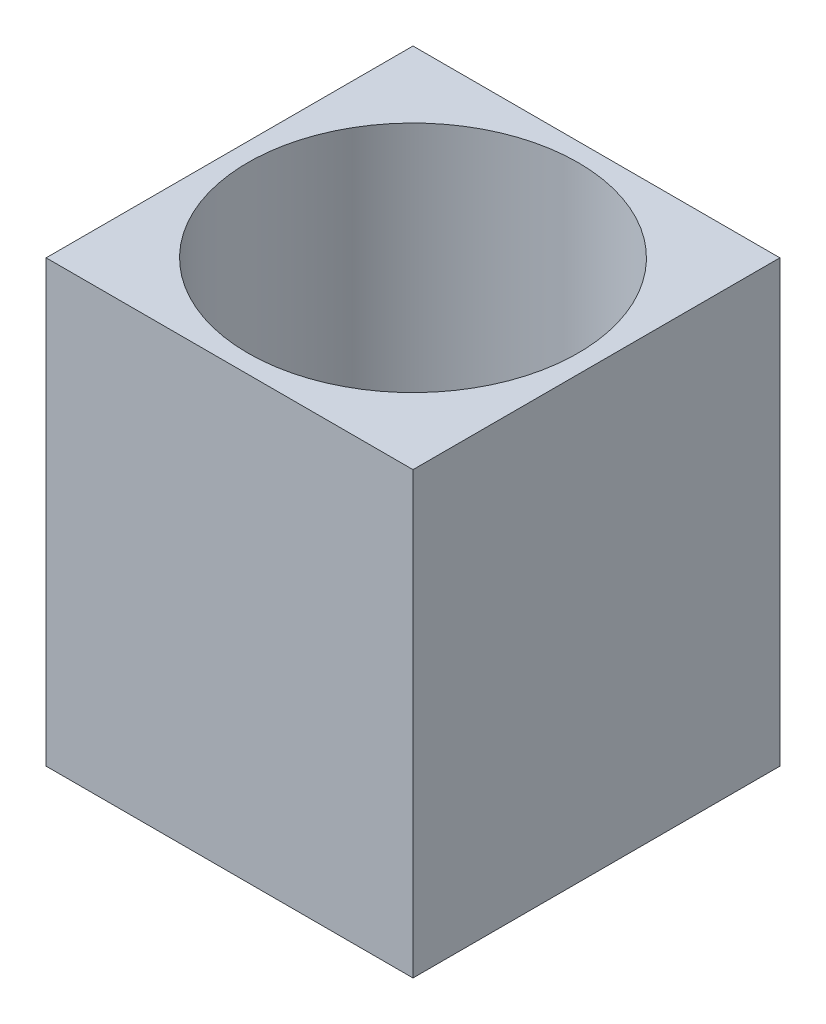
ISO-10303-21;
HEADER;
FILE_DESCRIPTION(('STEP AP214'),'2;1');
FILE_NAME('part.step','',(''),(''),'','','');
FILE_SCHEMA(('AUTOMOTIVE_DESIGN { 1 0 10303 214 1 1 1 1 }'));
ENDSEC;
DATA;
#1=APPLICATION_CONTEXT('core data for automotive mechanical design processes');
#2=APPLICATION_PROTOCOL_DEFINITION('international standard','automotive_design',2000,#1);
#3=PRODUCT_CONTEXT('',#1,'mechanical');
#4=PRODUCT('Part','Part','',(#3));
#5=PRODUCT_RELATED_PRODUCT_CATEGORY('part','',(#4));
#6=PRODUCT_DEFINITION_FORMATION('','',#4);
#7=PRODUCT_DEFINITION_CONTEXT('part definition',#1,'design');
#8=PRODUCT_DEFINITION('design','',#6,#7);
#9=PRODUCT_DEFINITION_SHAPE('','',#8);
#10=(LENGTH_UNIT() NAMED_UNIT(*) SI_UNIT(.MILLI.,.METRE.));
#11=(NAMED_UNIT(*) PLANE_ANGLE_UNIT() SI_UNIT($,.RADIAN.));
#12=(NAMED_UNIT(*) SI_UNIT($,.STERADIAN.) SOLID_ANGLE_UNIT());
#13=UNCERTAINTY_MEASURE_WITH_UNIT(LENGTH_MEASURE(1.E-05),#10,'distance_accuracy_value','');
#14=(GEOMETRIC_REPRESENTATION_CONTEXT(3) GLOBAL_UNCERTAINTY_ASSIGNED_CONTEXT((#13)) GLOBAL_UNIT_ASSIGNED_CONTEXT((#10,
#11,#12)) REPRESENTATION_CONTEXT('',''));
#15=CARTESIAN_POINT('',(0.,0.,0.));
#16=DIRECTION('',(0.,0.,1.));
#17=DIRECTION('',(1.,0.,0.));
#18=AXIS2_PLACEMENT_3D('',#15,#16,#17);
#19=CARTESIAN_POINT('',(317.5,-254.,317.5));
#20=DIRECTION('',(1.,0.,0.));
#21=DIRECTION('',(0.,0.,-1.));
#22=AXIS2_PLACEMENT_3D('',#19,#20,#21);
#23=PLANE('',#22);
#24=DIRECTION('',(0.,1.,0.));
#25=VECTOR('',#24,1.);
#26=CARTESIAN_POINT('',(317.5,-254.,-317.5));
#27=LINE('',#26,#25);
#28=CARTESIAN_POINT('',(317.5,-254.,-317.5));
#29=VERTEX_POINT('',#28);
#30=CARTESIAN_POINT('',(317.5,508.,-317.5));
#31=VERTEX_POINT('',#30);
#32=EDGE_CURVE('E36',#29,#31,#27,.T.);
#33=ORIENTED_EDGE('',*,*,#32,.T.);
#34=DIRECTION('',(0.,0.,-1.));
#35=VECTOR('',#34,1.);
#36=CARTESIAN_POINT('',(317.5,508.,317.5));
#37=LINE('',#36,#35);
#38=CARTESIAN_POINT('',(317.5,508.,317.5));
#39=VERTEX_POINT('',#38);
#40=EDGE_CURVE('E73',#39,#31,#37,.T.);
#41=ORIENTED_EDGE('',*,*,#40,.F.);
#42=DIRECTION('',(0.,1.,0.));
#43=VECTOR('',#42,1.);
#44=CARTESIAN_POINT('',(317.5,-254.,317.5));
#45=LINE('',#44,#43);
#46=CARTESIAN_POINT('',(317.5,-254.,317.5));
#47=VERTEX_POINT('',#46);
#48=EDGE_CURVE('E11',#47,#39,#45,.T.);
#49=ORIENTED_EDGE('',*,*,#48,.F.);
#50=DIRECTION('',(0.,0.,-1.));
#51=VECTOR('',#50,1.);
#52=CARTESIAN_POINT('',(317.5,-254.,317.5));
#53=LINE('',#52,#51);
#54=EDGE_CURVE('E74',#47,#29,#53,.T.);
#55=ORIENTED_EDGE('',*,*,#54,.T.);
#56=EDGE_LOOP('',(#33,#41,#49,#55));
#57=FACE_BOUND('',#56,.T.);
#58=ADVANCED_FACE('F33',(#57),#23,.T.);
#59=CARTESIAN_POINT('',(-317.5,-254.,317.5));
#60=DIRECTION('',(0.,0.,1.));
#61=DIRECTION('',(1.,0.,0.));
#62=AXIS2_PLACEMENT_3D('',#59,#60,#61);
#63=PLANE('',#62);
#64=ORIENTED_EDGE('',*,*,#48,.T.);
#65=DIRECTION('',(1.,0.,0.));
#66=VECTOR('',#65,1.);
#67=CARTESIAN_POINT('',(-317.5,508.,317.5));
#68=LINE('',#67,#66);
#69=CARTESIAN_POINT('',(-317.5,508.,317.5));
#70=VERTEX_POINT('',#69);
#71=EDGE_CURVE('E91',#70,#39,#68,.T.);
#72=ORIENTED_EDGE('',*,*,#71,.F.);
#73=DIRECTION('',(0.,1.,0.));
#74=VECTOR('',#73,1.);
#75=CARTESIAN_POINT('',(-317.5,-254.,317.5));
#76=LINE('',#75,#74);
#77=CARTESIAN_POINT('',(-317.5,-254.,317.5));
#78=VERTEX_POINT('',#77);
#79=EDGE_CURVE('E41',#78,#70,#76,.T.);
#80=ORIENTED_EDGE('',*,*,#79,.F.);
#81=DIRECTION('',(1.,0.,0.));
#82=VECTOR('',#81,1.);
#83=CARTESIAN_POINT('',(-317.5,-254.,317.5));
#84=LINE('',#83,#82);
#85=EDGE_CURVE('E79',#78,#47,#84,.T.);
#86=ORIENTED_EDGE('',*,*,#85,.T.);
#87=EDGE_LOOP('',(#64,#72,#80,#86));
#88=FACE_BOUND('',#87,.T.);
#89=ADVANCED_FACE('F112',(#88),#63,.T.);
#90=CARTESIAN_POINT('',(-317.5,-254.,317.5));
#91=DIRECTION('',(-1.,0.,0.));
#92=DIRECTION('',(0.,0.,1.));
#93=AXIS2_PLACEMENT_3D('',#90,#91,#92);
#94=PLANE('',#93);
#95=ORIENTED_EDGE('',*,*,#79,.T.);
#96=DIRECTION('',(0.,0.,1.));
#97=VECTOR('',#96,1.);
#98=CARTESIAN_POINT('',(-317.5,508.,317.5));
#99=LINE('',#98,#97);
#100=CARTESIAN_POINT('',(-317.5,508.,-317.5));
#101=VERTEX_POINT('',#100);
#102=EDGE_CURVE('E86',#101,#70,#99,.T.);
#103=ORIENTED_EDGE('',*,*,#102,.F.);
#104=DIRECTION('',(0.,1.,0.));
#105=VECTOR('',#104,1.);
#106=CARTESIAN_POINT('',(-317.5,-254.,-317.5));
#107=LINE('',#106,#105);
#108=CARTESIAN_POINT('',(-317.5,-254.,-317.5));
#109=VERTEX_POINT('',#108);
#110=EDGE_CURVE('E78',#109,#101,#107,.T.);
#111=ORIENTED_EDGE('',*,*,#110,.F.);
#112=DIRECTION('',(0.,0.,1.));
#113=VECTOR('',#112,1.);
#114=CARTESIAN_POINT('',(-317.5,-254.,317.5));
#115=LINE('',#114,#113);
#116=EDGE_CURVE('E105',#109,#78,#115,.T.);
#117=ORIENTED_EDGE('',*,*,#116,.T.);
#118=EDGE_LOOP('',(#95,#103,#111,#117));
#119=FACE_BOUND('',#118,.T.);
#120=ADVANCED_FACE('F109',(#119),#94,.T.);
#121=CARTESIAN_POINT('',(-317.5,-254.,-317.5));
#122=DIRECTION('',(0.,0.,-1.));
#123=DIRECTION('',(-1.,0.,0.));
#124=AXIS2_PLACEMENT_3D('',#121,#122,#123);
#125=PLANE('',#124);
#126=ORIENTED_EDGE('',*,*,#110,.T.);
#127=DIRECTION('',(-1.,0.,0.));
#128=VECTOR('',#127,1.);
#129=CARTESIAN_POINT('',(-317.5,508.,-317.5));
#130=LINE('',#129,#128);
#131=EDGE_CURVE('E81',#31,#101,#130,.T.);
#132=ORIENTED_EDGE('',*,*,#131,.F.);
#133=ORIENTED_EDGE('',*,*,#32,.F.);
#134=DIRECTION('',(-1.,0.,0.));
#135=VECTOR('',#134,1.);
#136=CARTESIAN_POINT('',(-317.5,-254.,-317.5));
#137=LINE('',#136,#135);
#138=EDGE_CURVE('E103',#29,#109,#137,.T.);
#139=ORIENTED_EDGE('',*,*,#138,.T.);
#140=EDGE_LOOP('',(#126,#132,#133,#139));
#141=FACE_BOUND('',#140,.T.);
#142=ADVANCED_FACE('F82',(#141),#125,.T.);
#143=CARTESIAN_POINT('',(0.,-254.,0.));
#144=DIRECTION('',(0.,-1.,0.));
#145=DIRECTION('',(0.,0.,-1.));
#146=AXIS2_PLACEMENT_3D('',#143,#144,#145);
#147=PLANE('',#146);
#148=CARTESIAN_POINT('',(0.,-254.,0.));
#149=DIRECTION('',(0.,1.,0.));
#150=DIRECTION('',(0.,0.,1.));
#151=AXIS2_PLACEMENT_3D('',#148,#149,#150);
#152=CIRCLE('',#151,285.75);
#153=CARTESIAN_POINT('',(0.,-254.,285.75));
#154=VERTEX_POINT('',#153);
#155=EDGE_CURVE('E99',#154,#154,#152,.T.);
#156=ORIENTED_EDGE('',*,*,#155,.T.);
#157=EDGE_LOOP('',(#156));
#158=FACE_BOUND('',#157,.T.);
#159=ORIENTED_EDGE('',*,*,#54,.F.);
#160=ORIENTED_EDGE('',*,*,#85,.F.);
#161=ORIENTED_EDGE('',*,*,#116,.F.);
#162=ORIENTED_EDGE('',*,*,#138,.F.);
#163=EDGE_LOOP('',(#159,#160,#161,#162));
#164=FACE_BOUND('',#163,.T.);
#165=ADVANCED_FACE('F114',(#158,#164),#147,.T.);
#166=CARTESIAN_POINT('',(0.,-254.,0.));
#167=DIRECTION('',(0.,1.,0.));
#168=DIRECTION('',(0.,0.,1.));
#169=AXIS2_PLACEMENT_3D('',#166,#167,#168);
#170=CYLINDRICAL_SURFACE('',#169,285.75);
#171=ORIENTED_EDGE('',*,*,#155,.F.);
#172=EDGE_LOOP('',(#171));
#173=FACE_BOUND('',#172,.T.);
#174=CARTESIAN_POINT('',(0.,508.,0.));
#175=DIRECTION('',(0.,1.,0.));
#176=DIRECTION('',(0.,0.,1.));
#177=AXIS2_PLACEMENT_3D('',#174,#175,#176);
#178=CIRCLE('',#177,285.75);
#179=CARTESIAN_POINT('',(0.,508.,285.75));
#180=VERTEX_POINT('',#179);
#181=EDGE_CURVE('E92',#180,#180,#178,.T.);
#182=ORIENTED_EDGE('',*,*,#181,.T.);
#183=EDGE_LOOP('',(#182));
#184=FACE_BOUND('',#183,.T.);
#185=ADVANCED_FACE('F116',(#173,#184),#170,.F.);
#186=CARTESIAN_POINT('',(0.,508.,0.));
#187=DIRECTION('',(0.,-1.,0.));
#188=DIRECTION('',(0.,0.,-1.));
#189=AXIS2_PLACEMENT_3D('',#186,#187,#188);
#190=PLANE('',#189);
#191=ORIENTED_EDGE('',*,*,#40,.T.);
#192=ORIENTED_EDGE('',*,*,#131,.T.);
#193=ORIENTED_EDGE('',*,*,#102,.T.);
#194=ORIENTED_EDGE('',*,*,#71,.T.);
#195=EDGE_LOOP('',(#191,#192,#193,#194));
#196=FACE_BOUND('',#195,.T.);
#197=ORIENTED_EDGE('',*,*,#181,.F.);
#198=EDGE_LOOP('',(#197));
#199=FACE_BOUND('',#198,.T.);
#200=ADVANCED_FACE('F89',(#196,#199),#190,.F.);
#201=CLOSED_SHELL('',(#58,#89,#120,#142,#165,#185,#200));
#202=MANIFOLD_SOLID_BREP('B2',#201);
#203=ADVANCED_BREP_SHAPE_REPRESENTATION('',(#18,#202),#14);
#204=SHAPE_DEFINITION_REPRESENTATION(#9,#203);
ENDSEC;
END-ISO-10303-21;
